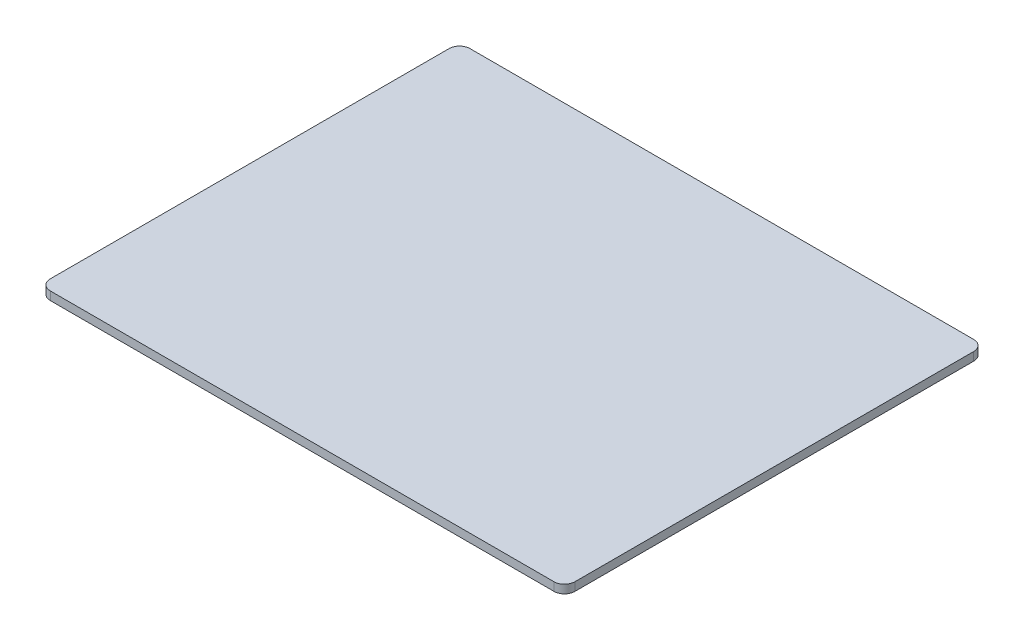
ISO-10303-21;
HEADER;
FILE_DESCRIPTION(('STEP AP214'),'2;1');
FILE_NAME('part.step','',(''),(''),'','','');
FILE_SCHEMA(('AUTOMOTIVE_DESIGN { 1 0 10303 214 1 1 1 1 }'));
ENDSEC;
DATA;
#1=APPLICATION_CONTEXT('core data for automotive mechanical design processes');
#2=APPLICATION_PROTOCOL_DEFINITION('international standard','automotive_design',2000,#1);
#3=PRODUCT_CONTEXT('',#1,'mechanical');
#4=PRODUCT('Part','Part','',(#3));
#5=PRODUCT_RELATED_PRODUCT_CATEGORY('part','',(#4));
#6=PRODUCT_DEFINITION_FORMATION('','',#4);
#7=PRODUCT_DEFINITION_CONTEXT('part definition',#1,'design');
#8=PRODUCT_DEFINITION('design','',#6,#7);
#9=PRODUCT_DEFINITION_SHAPE('','',#8);
#10=(LENGTH_UNIT() NAMED_UNIT(*) SI_UNIT(.MILLI.,.METRE.));
#11=(NAMED_UNIT(*) PLANE_ANGLE_UNIT() SI_UNIT($,.RADIAN.));
#12=(NAMED_UNIT(*) SI_UNIT($,.STERADIAN.) SOLID_ANGLE_UNIT());
#13=UNCERTAINTY_MEASURE_WITH_UNIT(LENGTH_MEASURE(1.E-05),#10,'distance_accuracy_value','');
#14=(GEOMETRIC_REPRESENTATION_CONTEXT(3) GLOBAL_UNCERTAINTY_ASSIGNED_CONTEXT((#13)) GLOBAL_UNIT_ASSIGNED_CONTEXT((#10,
#11,#12)) REPRESENTATION_CONTEXT('',''));
#15=CARTESIAN_POINT('',(0.,0.,0.));
#16=DIRECTION('',(0.,0.,1.));
#17=DIRECTION('',(1.,0.,0.));
#18=AXIS2_PLACEMENT_3D('',#15,#16,#17);
#19=CARTESIAN_POINT('',(50.,1.6,40.));
#20=DIRECTION('',(-1.,0.,0.));
#21=DIRECTION('',(0.,0.,1.));
#22=AXIS2_PLACEMENT_3D('',#19,#20,#21);
#23=PLANE('',#22);
#24=DIRECTION('',(0.,0.,-1.));
#25=VECTOR('',#24,1.);
#26=CARTESIAN_POINT('',(50.,0.,40.));
#27=LINE('',#26,#25);
#28=CARTESIAN_POINT('',(50.,0.,38.));
#29=VERTEX_POINT('',#28);
#30=CARTESIAN_POINT('',(50.,0.,-38.));
#31=VERTEX_POINT('',#30);
#32=EDGE_CURVE('E130',#29,#31,#27,.T.);
#33=ORIENTED_EDGE('',*,*,#32,.T.);
#34=DIRECTION('',(0.,-1.,0.));
#35=VECTOR('',#34,1.);
#36=CARTESIAN_POINT('',(50.,1.6,-38.));
#37=LINE('',#36,#35);
#38=CARTESIAN_POINT('',(50.,1.6,-38.));
#39=VERTEX_POINT('',#38);
#40=EDGE_CURVE('E108',#31,#39,#37,.F.);
#41=ORIENTED_EDGE('',*,*,#40,.T.);
#42=DIRECTION('',(0.,0.,-1.));
#43=VECTOR('',#42,1.);
#44=CARTESIAN_POINT('',(50.,1.6,40.));
#45=LINE('',#44,#43);
#46=CARTESIAN_POINT('',(50.,1.6,38.));
#47=VERTEX_POINT('',#46);
#48=EDGE_CURVE('E139',#47,#39,#45,.T.);
#49=ORIENTED_EDGE('',*,*,#48,.F.);
#50=DIRECTION('',(0.,-1.,0.));
#51=VECTOR('',#50,1.);
#52=CARTESIAN_POINT('',(50.,1.6,38.));
#53=LINE('',#52,#51);
#54=EDGE_CURVE('E113',#47,#29,#53,.T.);
#55=ORIENTED_EDGE('',*,*,#54,.T.);
#56=EDGE_LOOP('',(#33,#41,#49,#55));
#57=FACE_BOUND('',#56,.T.);
#58=ADVANCED_FACE('F37',(#57),#23,.F.);
#59=CARTESIAN_POINT('',(-50.,1.6,-40.));
#60=DIRECTION('',(0.,0.,1.));
#61=DIRECTION('',(1.,0.,0.));
#62=AXIS2_PLACEMENT_3D('',#59,#60,#61);
#63=PLANE('',#62);
#64=DIRECTION('',(-1.,0.,0.));
#65=VECTOR('',#64,1.);
#66=CARTESIAN_POINT('',(-50.,1.6,-40.));
#67=LINE('',#66,#65);
#68=CARTESIAN_POINT('',(48.,1.6,-40.));
#69=VERTEX_POINT('',#68);
#70=CARTESIAN_POINT('',(-48.,1.6,-40.));
#71=VERTEX_POINT('',#70);
#72=EDGE_CURVE('E123',#69,#71,#67,.T.);
#73=ORIENTED_EDGE('',*,*,#72,.F.);
#74=DIRECTION('',(0.,-1.,0.));
#75=VECTOR('',#74,1.);
#76=CARTESIAN_POINT('',(48.,1.6,-40.));
#77=LINE('',#76,#75);
#78=CARTESIAN_POINT('',(48.,0.,-40.));
#79=VERTEX_POINT('',#78);
#80=EDGE_CURVE('E107',#69,#79,#77,.T.);
#81=ORIENTED_EDGE('',*,*,#80,.T.);
#82=DIRECTION('',(-1.,0.,0.));
#83=VECTOR('',#82,1.);
#84=CARTESIAN_POINT('',(-50.,0.,-40.));
#85=LINE('',#84,#83);
#86=CARTESIAN_POINT('',(-48.,0.,-40.));
#87=VERTEX_POINT('',#86);
#88=EDGE_CURVE('E120',#79,#87,#85,.T.);
#89=ORIENTED_EDGE('',*,*,#88,.T.);
#90=DIRECTION('',(0.,-1.,0.));
#91=VECTOR('',#90,1.);
#92=CARTESIAN_POINT('',(-48.,1.6,-40.));
#93=LINE('',#92,#91);
#94=EDGE_CURVE('E125',#87,#71,#93,.F.);
#95=ORIENTED_EDGE('',*,*,#94,.T.);
#96=EDGE_LOOP('',(#73,#81,#89,#95));
#97=FACE_BOUND('',#96,.T.);
#98=ADVANCED_FACE('F119',(#97),#63,.F.);
#99=CARTESIAN_POINT('',(-50.,1.6,40.));
#100=DIRECTION('',(1.,0.,0.));
#101=DIRECTION('',(0.,0.,-1.));
#102=AXIS2_PLACEMENT_3D('',#99,#100,#101);
#103=PLANE('',#102);
#104=DIRECTION('',(0.,0.,1.));
#105=VECTOR('',#104,1.);
#106=CARTESIAN_POINT('',(-50.,1.6,40.));
#107=LINE('',#106,#105);
#108=CARTESIAN_POINT('',(-50.,1.6,-38.));
#109=VERTEX_POINT('',#108);
#110=CARTESIAN_POINT('',(-50.,1.6,38.));
#111=VERTEX_POINT('',#110);
#112=EDGE_CURVE('E165',#109,#111,#107,.T.);
#113=ORIENTED_EDGE('',*,*,#112,.F.);
#114=DIRECTION('',(0.,-1.,0.));
#115=VECTOR('',#114,1.);
#116=CARTESIAN_POINT('',(-50.,1.6,-38.));
#117=LINE('',#116,#115);
#118=CARTESIAN_POINT('',(-50.,0.,-38.));
#119=VERTEX_POINT('',#118);
#120=EDGE_CURVE('E158',#109,#119,#117,.T.);
#121=ORIENTED_EDGE('',*,*,#120,.T.);
#122=DIRECTION('',(0.,0.,1.));
#123=VECTOR('',#122,1.);
#124=CARTESIAN_POINT('',(-50.,0.,40.));
#125=LINE('',#124,#123);
#126=CARTESIAN_POINT('',(-50.,0.,38.));
#127=VERTEX_POINT('',#126);
#128=EDGE_CURVE('E129',#119,#127,#125,.T.);
#129=ORIENTED_EDGE('',*,*,#128,.T.);
#130=DIRECTION('',(0.,-1.,0.));
#131=VECTOR('',#130,1.);
#132=CARTESIAN_POINT('',(-50.,1.6,38.));
#133=LINE('',#132,#131);
#134=EDGE_CURVE('E156',#127,#111,#133,.F.);
#135=ORIENTED_EDGE('',*,*,#134,.T.);
#136=EDGE_LOOP('',(#113,#121,#129,#135));
#137=FACE_BOUND('',#136,.T.);
#138=ADVANCED_FACE('F163',(#137),#103,.F.);
#139=CARTESIAN_POINT('',(-50.,1.6,40.));
#140=DIRECTION('',(0.,0.,-1.));
#141=DIRECTION('',(-1.,0.,0.));
#142=AXIS2_PLACEMENT_3D('',#139,#140,#141);
#143=PLANE('',#142);
#144=DIRECTION('',(1.,0.,0.));
#145=VECTOR('',#144,1.);
#146=CARTESIAN_POINT('',(-50.,1.6,40.));
#147=LINE('',#146,#145);
#148=CARTESIAN_POINT('',(-48.,1.6,40.));
#149=VERTEX_POINT('',#148);
#150=CARTESIAN_POINT('',(48.,1.6,40.));
#151=VERTEX_POINT('',#150);
#152=EDGE_CURVE('E140',#149,#151,#147,.T.);
#153=ORIENTED_EDGE('',*,*,#152,.F.);
#154=DIRECTION('',(0.,-1.,0.));
#155=VECTOR('',#154,1.);
#156=CARTESIAN_POINT('',(-48.,1.6,40.));
#157=LINE('',#156,#155);
#158=CARTESIAN_POINT('',(-48.,0.,40.));
#159=VERTEX_POINT('',#158);
#160=EDGE_CURVE('E11',#149,#159,#157,.T.);
#161=ORIENTED_EDGE('',*,*,#160,.T.);
#162=DIRECTION('',(1.,0.,0.));
#163=VECTOR('',#162,1.);
#164=CARTESIAN_POINT('',(-50.,0.,40.));
#165=LINE('',#164,#163);
#166=CARTESIAN_POINT('',(48.,0.,40.));
#167=VERTEX_POINT('',#166);
#168=EDGE_CURVE('E133',#159,#167,#165,.T.);
#169=ORIENTED_EDGE('',*,*,#168,.T.);
#170=DIRECTION('',(0.,-1.,0.));
#171=VECTOR('',#170,1.);
#172=CARTESIAN_POINT('',(48.,1.6,40.));
#173=LINE('',#172,#171);
#174=EDGE_CURVE('E45',#167,#151,#173,.F.);
#175=ORIENTED_EDGE('',*,*,#174,.T.);
#176=EDGE_LOOP('',(#153,#161,#169,#175));
#177=FACE_BOUND('',#176,.T.);
#178=ADVANCED_FACE('F172',(#177),#143,.F.);
#179=CARTESIAN_POINT('',(0.,1.6,0.));
#180=DIRECTION('',(0.,-1.,0.));
#181=DIRECTION('',(0.,0.,-1.));
#182=AXIS2_PLACEMENT_3D('',#179,#180,#181);
#183=PLANE('',#182);
#184=ORIENTED_EDGE('',*,*,#48,.T.);
#185=CARTESIAN_POINT('',(48.,1.6,-38.));
#186=DIRECTION('',(0.,-1.,0.));
#187=DIRECTION('',(0.,0.,-1.));
#188=AXIS2_PLACEMENT_3D('',#185,#186,#187);
#189=CIRCLE('',#188,2.);
#190=EDGE_CURVE('E154',#39,#69,#189,.F.);
#191=ORIENTED_EDGE('',*,*,#190,.T.);
#192=ORIENTED_EDGE('',*,*,#72,.T.);
#193=CARTESIAN_POINT('',(-48.,1.6,-38.));
#194=DIRECTION('',(0.,-1.,0.));
#195=DIRECTION('',(0.,0.,-1.));
#196=AXIS2_PLACEMENT_3D('',#193,#194,#195);
#197=CIRCLE('',#196,2.);
#198=EDGE_CURVE('E152',#71,#109,#197,.F.);
#199=ORIENTED_EDGE('',*,*,#198,.T.);
#200=ORIENTED_EDGE('',*,*,#112,.T.);
#201=CARTESIAN_POINT('',(-48.,1.6,38.));
#202=DIRECTION('',(0.,-1.,0.));
#203=DIRECTION('',(0.,0.,-1.));
#204=AXIS2_PLACEMENT_3D('',#201,#202,#203);
#205=CIRCLE('',#204,2.);
#206=EDGE_CURVE('E58',#111,#149,#205,.F.);
#207=ORIENTED_EDGE('',*,*,#206,.T.);
#208=ORIENTED_EDGE('',*,*,#152,.T.);
#209=CARTESIAN_POINT('',(48.,1.6,38.));
#210=DIRECTION('',(0.,-1.,0.));
#211=DIRECTION('',(0.,0.,-1.));
#212=AXIS2_PLACEMENT_3D('',#209,#210,#211);
#213=CIRCLE('',#212,2.);
#214=EDGE_CURVE('E149',#151,#47,#213,.F.);
#215=ORIENTED_EDGE('',*,*,#214,.T.);
#216=EDGE_LOOP('',(#184,#191,#192,#199,#200,#207,#208,#215));
#217=FACE_BOUND('',#216,.T.);
#218=ADVANCED_FACE('F179',(#217),#183,.F.);
#219=CARTESIAN_POINT('',(0.,0.,0.));
#220=DIRECTION('',(0.,-1.,0.));
#221=DIRECTION('',(0.,0.,-1.));
#222=AXIS2_PLACEMENT_3D('',#219,#220,#221);
#223=PLANE('',#222);
#224=ORIENTED_EDGE('',*,*,#88,.F.);
#225=CARTESIAN_POINT('',(48.,0.,-38.));
#226=DIRECTION('',(0.,-1.,0.));
#227=DIRECTION('',(0.,0.,-1.));
#228=AXIS2_PLACEMENT_3D('',#225,#226,#227);
#229=CIRCLE('',#228,2.);
#230=EDGE_CURVE('E103',#79,#31,#229,.T.);
#231=ORIENTED_EDGE('',*,*,#230,.T.);
#232=ORIENTED_EDGE('',*,*,#32,.F.);
#233=CARTESIAN_POINT('',(48.,0.,38.));
#234=DIRECTION('',(0.,-1.,0.));
#235=DIRECTION('',(0.,0.,-1.));
#236=AXIS2_PLACEMENT_3D('',#233,#234,#235);
#237=CIRCLE('',#236,2.);
#238=EDGE_CURVE('E124',#29,#167,#237,.T.);
#239=ORIENTED_EDGE('',*,*,#238,.T.);
#240=ORIENTED_EDGE('',*,*,#168,.F.);
#241=CARTESIAN_POINT('',(-48.,0.,38.));
#242=DIRECTION('',(0.,-1.,0.));
#243=DIRECTION('',(0.,0.,-1.));
#244=AXIS2_PLACEMENT_3D('',#241,#242,#243);
#245=CIRCLE('',#244,2.);
#246=EDGE_CURVE('E143',#159,#127,#245,.T.);
#247=ORIENTED_EDGE('',*,*,#246,.T.);
#248=ORIENTED_EDGE('',*,*,#128,.F.);
#249=CARTESIAN_POINT('',(-48.,0.,-38.));
#250=DIRECTION('',(0.,-1.,0.));
#251=DIRECTION('',(0.,0.,-1.));
#252=AXIS2_PLACEMENT_3D('',#249,#250,#251);
#253=CIRCLE('',#252,2.);
#254=EDGE_CURVE('E114',#119,#87,#253,.T.);
#255=ORIENTED_EDGE('',*,*,#254,.T.);
#256=EDGE_LOOP('',(#224,#231,#232,#239,#240,#247,#248,#255));
#257=FACE_BOUND('',#256,.T.);
#258=ADVANCED_FACE('F127',(#257),#223,.T.);
#259=CARTESIAN_POINT('',(48.,1.6,-38.));
#260=DIRECTION('',(0.,-1.,0.));
#261=DIRECTION('',(0.,0.,-1.));
#262=AXIS2_PLACEMENT_3D('',#259,#260,#261);
#263=CYLINDRICAL_SURFACE('',#262,2.);
#264=ORIENTED_EDGE('',*,*,#190,.F.);
#265=ORIENTED_EDGE('',*,*,#40,.F.);
#266=ORIENTED_EDGE('',*,*,#230,.F.);
#267=ORIENTED_EDGE('',*,*,#80,.F.);
#268=EDGE_LOOP('',(#264,#265,#266,#267));
#269=FACE_BOUND('',#268,.T.);
#270=ADVANCED_FACE('F106',(#269),#263,.T.);
#271=CARTESIAN_POINT('',(-48.,1.6,-38.));
#272=DIRECTION('',(0.,-1.,0.));
#273=DIRECTION('',(0.,0.,-1.));
#274=AXIS2_PLACEMENT_3D('',#271,#272,#273);
#275=CYLINDRICAL_SURFACE('',#274,2.);
#276=ORIENTED_EDGE('',*,*,#198,.F.);
#277=ORIENTED_EDGE('',*,*,#94,.F.);
#278=ORIENTED_EDGE('',*,*,#254,.F.);
#279=ORIENTED_EDGE('',*,*,#120,.F.);
#280=EDGE_LOOP('',(#276,#277,#278,#279));
#281=FACE_BOUND('',#280,.T.);
#282=ADVANCED_FACE('F187',(#281),#275,.T.);
#283=CARTESIAN_POINT('',(-48.,1.6,38.));
#284=DIRECTION('',(0.,-1.,0.));
#285=DIRECTION('',(0.,0.,-1.));
#286=AXIS2_PLACEMENT_3D('',#283,#284,#285);
#287=CYLINDRICAL_SURFACE('',#286,2.);
#288=ORIENTED_EDGE('',*,*,#206,.F.);
#289=ORIENTED_EDGE('',*,*,#134,.F.);
#290=ORIENTED_EDGE('',*,*,#246,.F.);
#291=ORIENTED_EDGE('',*,*,#160,.F.);
#292=EDGE_LOOP('',(#288,#289,#290,#291));
#293=FACE_BOUND('',#292,.T.);
#294=ADVANCED_FACE('F171',(#293),#287,.T.);
#295=CARTESIAN_POINT('',(48.,1.6,38.));
#296=DIRECTION('',(0.,-1.,0.));
#297=DIRECTION('',(0.,0.,-1.));
#298=AXIS2_PLACEMENT_3D('',#295,#296,#297);
#299=CYLINDRICAL_SURFACE('',#298,2.);
#300=ORIENTED_EDGE('',*,*,#214,.F.);
#301=ORIENTED_EDGE('',*,*,#174,.F.);
#302=ORIENTED_EDGE('',*,*,#238,.F.);
#303=ORIENTED_EDGE('',*,*,#54,.F.);
#304=EDGE_LOOP('',(#300,#301,#302,#303));
#305=FACE_BOUND('',#304,.T.);
#306=ADVANCED_FACE('F39',(#305),#299,.T.);
#307=CLOSED_SHELL('',(#58,#98,#138,#178,#218,#258,#270,#282,#294,#306));
#308=MANIFOLD_SOLID_BREP('B2',#307);
#309=ADVANCED_BREP_SHAPE_REPRESENTATION('',(#18,#308),#14);
#310=SHAPE_DEFINITION_REPRESENTATION(#9,#309);
ENDSEC;
END-ISO-10303-21;
